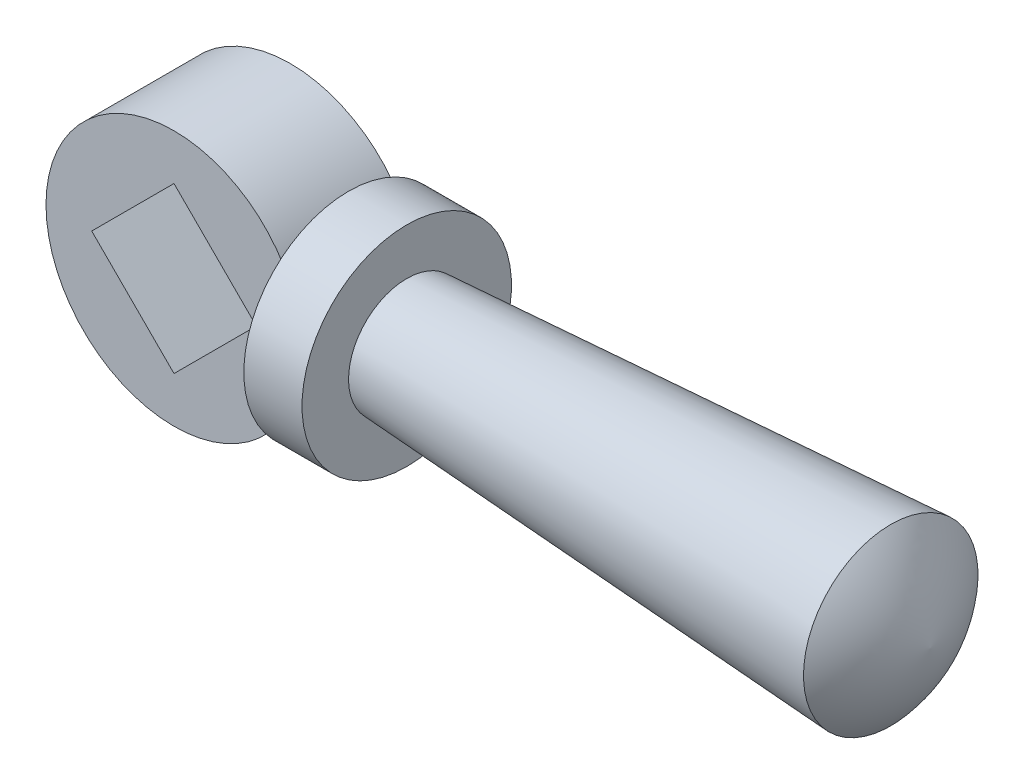
ISO-10303-21;
HEADER;
FILE_DESCRIPTION(('STEP AP214'),'2;1');
FILE_NAME('part.step','',(''),(''),'','','');
FILE_SCHEMA(('AUTOMOTIVE_DESIGN { 1 0 10303 214 1 1 1 1 }'));
ENDSEC;
DATA;
#1=APPLICATION_CONTEXT('core data for automotive mechanical design processes');
#2=APPLICATION_PROTOCOL_DEFINITION('international standard','automotive_design',2000,#1);
#3=PRODUCT_CONTEXT('',#1,'mechanical');
#4=PRODUCT('Part','Part','',(#3));
#5=PRODUCT_RELATED_PRODUCT_CATEGORY('part','',(#4));
#6=PRODUCT_DEFINITION_FORMATION('','',#4);
#7=PRODUCT_DEFINITION_CONTEXT('part definition',#1,'design');
#8=PRODUCT_DEFINITION('design','',#6,#7);
#9=PRODUCT_DEFINITION_SHAPE('','',#8);
#10=(LENGTH_UNIT() NAMED_UNIT(*) SI_UNIT(.MILLI.,.METRE.));
#11=(NAMED_UNIT(*) PLANE_ANGLE_UNIT() SI_UNIT($,.RADIAN.));
#12=(NAMED_UNIT(*) SI_UNIT($,.STERADIAN.) SOLID_ANGLE_UNIT());
#13=UNCERTAINTY_MEASURE_WITH_UNIT(LENGTH_MEASURE(1.E-05),#10,'distance_accuracy_value','');
#14=(GEOMETRIC_REPRESENTATION_CONTEXT(3) GLOBAL_UNCERTAINTY_ASSIGNED_CONTEXT((#13)) GLOBAL_UNIT_ASSIGNED_CONTEXT((#10,
#11,#12)) REPRESENTATION_CONTEXT('',''));
#15=CARTESIAN_POINT('',(0.,0.,0.));
#16=DIRECTION('',(0.,0.,1.));
#17=DIRECTION('',(1.,0.,0.));
#18=AXIS2_PLACEMENT_3D('',#15,#16,#17);
#19=CARTESIAN_POINT('',(0.,-1.81755722373603,0.));
#20=DIRECTION('',(1.,0.,0.));
#21=DIRECTION('',(0.,1.,0.));
#22=AXIS2_PLACEMENT_3D('',#19,#20,#21);
#23=PLANE('',#22);
#24=CARTESIAN_POINT('',(0.,-1.81755722373603,0.));
#25=DIRECTION('',(1.,0.,0.));
#26=DIRECTION('',(0.,1.,0.));
#27=AXIS2_PLACEMENT_3D('',#24,#25,#26);
#28=CIRCLE('',#27,9.);
#29=CARTESIAN_POINT('',(0.,7.18244277626397,0.));
#30=VERTEX_POINT('',#29);
#31=EDGE_CURVE('E135',#30,#30,#28,.T.);
#32=ORIENTED_EDGE('',*,*,#31,.F.);
#33=EDGE_LOOP('',(#32));
#34=FACE_BOUND('',#33,.T.);
#35=DIRECTION('',(0.,-1.,0.));
#36=VECTOR('',#35,1.);
#37=CARTESIAN_POINT('',(0.,-1.81755722373603,-5.));
#38=LINE('',#37,#36);
#39=CARTESIAN_POINT('',(0.,2.7650184712198,-5.));
#40=VERTEX_POINT('',#39);
#41=CARTESIAN_POINT('',(0.,-6.40013291869187,-5.));
#42=VERTEX_POINT('',#41);
#43=EDGE_CURVE('E11',#40,#42,#38,.T.);
#44=ORIENTED_EDGE('',*,*,#43,.F.);
#45=DIRECTION('',(0.,0.,1.));
#46=VECTOR('',#45,1.);
#47=CARTESIAN_POINT('',(0.,2.7650184712198,-5.));
#48=LINE('',#47,#46);
#49=CARTESIAN_POINT('',(0.,2.7650184712198,5.));
#50=VERTEX_POINT('',#49);
#51=EDGE_CURVE('E44',#40,#50,#48,.T.);
#52=ORIENTED_EDGE('',*,*,#51,.T.);
#53=DIRECTION('',(0.,-1.,0.));
#54=VECTOR('',#53,1.);
#55=CARTESIAN_POINT('',(0.,-1.81755722373603,5.));
#56=LINE('',#55,#54);
#57=CARTESIAN_POINT('',(0.,-6.40013291869187,5.));
#58=VERTEX_POINT('',#57);
#59=EDGE_CURVE('E147',#50,#58,#56,.T.);
#60=ORIENTED_EDGE('',*,*,#59,.T.);
#61=DIRECTION('',(0.,0.,1.));
#62=VECTOR('',#61,1.);
#63=CARTESIAN_POINT('',(0.,-6.40013291869187,-5.));
#64=LINE('',#63,#62);
#65=EDGE_CURVE('E150',#58,#42,#64,.F.);
#66=ORIENTED_EDGE('',*,*,#65,.T.);
#67=EDGE_LOOP('',(#44,#52,#60,#66));
#68=FACE_BOUND('',#67,.T.);
#69=ADVANCED_FACE('F37',(#34,#68),#23,.F.);
#70=CARTESIAN_POINT('',(35.1645667980468,-4.03339153847741,0.));
#71=DIRECTION('',(0.,0.,-1.));
#72=DIRECTION('',(0.,1.,0.));
#73=AXIS2_PLACEMENT_3D('',#70,#71,#72);
#74=CIRCLE('',#73,15.);
#75=TRIMMED_CURVE('',#74,(PARAMETER_VALUE(-1.42253143088032)),
(PARAMETER_VALUE(1.42253143088032)),.T.,.PARAMETER.);
#76=CARTESIAN_POINT('',(35.1645667980468,-1.81755722373603,0.));
#77=DIRECTION('',(1.,0.,0.));
#78=AXIS1_PLACEMENT('',#76,#77);
#79=SURFACE_OF_REVOLUTION('',#75,#78);
#80=CARTESIAN_POINT('',(50.,-1.81755722373603,0.));
#81=VERTEX_POINT('',#80);
#82=VERTEX_LOOP('',#81);
#83=FACE_BOUND('',#82,.T.);
#84=CARTESIAN_POINT('',(46.592714660605,-1.81755722373603,0.));
#85=DIRECTION('',(1.,0.,0.));
#86=DIRECTION('',(0.,1.,0.));
#87=AXIS2_PLACEMENT_3D('',#84,#85,#86);
#88=CIRCLE('',#87,7.5);
#89=CARTESIAN_POINT('',(46.592714660605,5.68244277626398,0.));
#90=VERTEX_POINT('',#89);
#91=EDGE_CURVE('E144',#90,#90,#88,.T.);
#92=ORIENTED_EDGE('',*,*,#91,.T.);
#93=EDGE_LOOP('',(#92));
#94=FACE_BOUND('',#93,.T.);
#95=ADVANCED_FACE('F172',(#83,#94),#79,.T.);
#96=CARTESIAN_POINT('',(5.,-1.81755722373603,0.));
#97=DIRECTION('',(1.,0.,0.));
#98=DIRECTION('',(0.,1.,0.));
#99=AXIS2_PLACEMENT_3D('',#96,#97,#98);
#100=CONICAL_SURFACE('',#99,5.,0.0600344520015872);
#101=ORIENTED_EDGE('',*,*,#91,.F.);
#102=EDGE_LOOP('',(#101));
#103=FACE_BOUND('',#102,.T.);
#104=CARTESIAN_POINT('',(5.,-1.81755722373603,0.));
#105=DIRECTION('',(1.,0.,0.));
#106=DIRECTION('',(0.,1.,0.));
#107=AXIS2_PLACEMENT_3D('',#104,#105,#106);
#108=CIRCLE('',#107,5.);
#109=CARTESIAN_POINT('',(5.,3.18244277626397,0.));
#110=VERTEX_POINT('',#109);
#111=EDGE_CURVE('E141',#110,#110,#108,.T.);
#112=ORIENTED_EDGE('',*,*,#111,.T.);
#113=EDGE_LOOP('',(#112));
#114=FACE_BOUND('',#113,.T.);
#115=ADVANCED_FACE('F177',(#103,#114),#100,.T.);
#116=CARTESIAN_POINT('',(5.,-6.81755722373603,0.));
#117=DIRECTION('',(-1.,0.,0.));
#118=DIRECTION('',(0.,-1.,0.));
#119=AXIS2_PLACEMENT_3D('',#116,#117,#118);
#120=PLANE('',#119);
#121=ORIENTED_EDGE('',*,*,#111,.F.);
#122=EDGE_LOOP('',(#121));
#123=FACE_BOUND('',#122,.T.);
#124=CARTESIAN_POINT('',(5.,-1.81755722373603,0.));
#125=DIRECTION('',(1.,0.,0.));
#126=DIRECTION('',(0.,1.,0.));
#127=AXIS2_PLACEMENT_3D('',#124,#125,#126);
#128=CIRCLE('',#127,9.);
#129=CARTESIAN_POINT('',(5.,7.18244277626397,0.));
#130=VERTEX_POINT('',#129);
#131=EDGE_CURVE('E138',#130,#130,#128,.T.);
#132=ORIENTED_EDGE('',*,*,#131,.T.);
#133=EDGE_LOOP('',(#132));
#134=FACE_BOUND('',#133,.T.);
#135=ADVANCED_FACE('F181',(#123,#134),#120,.F.);
#136=CARTESIAN_POINT('',(0.,-1.81755722373603,0.));
#137=DIRECTION('',(1.,0.,0.));
#138=DIRECTION('',(0.,1.,0.));
#139=AXIS2_PLACEMENT_3D('',#136,#137,#138);
#140=CYLINDRICAL_SURFACE('',#139,9.);
#141=ORIENTED_EDGE('',*,*,#131,.F.);
#142=EDGE_LOOP('',(#141));
#143=FACE_BOUND('',#142,.T.);
#144=ORIENTED_EDGE('',*,*,#31,.T.);
#145=EDGE_LOOP('',(#144));
#146=FACE_BOUND('',#145,.T.);
#147=ADVANCED_FACE('F168',(#143,#146),#140,.T.);
#148=CARTESIAN_POINT('',(-10.,-1.81755722373603,-5.));
#149=DIRECTION('',(0.,0.,1.));
#150=DIRECTION('',(1.,0.,0.));
#151=AXIS2_PLACEMENT_3D('',#148,#149,#150);
#152=CYLINDRICAL_SURFACE('',#151,11.);
#153=ORIENTED_EDGE('',*,*,#51,.F.);
#154=CARTESIAN_POINT('',(-10.,-1.81755722373603,-5.));
#155=DIRECTION('',(0.,0.,1.));
#156=DIRECTION('',(1.,0.,0.));
#157=AXIS2_PLACEMENT_3D('',#154,#155,#156);
#158=CIRCLE('',#157,11.);
#159=EDGE_CURVE('E129',#40,#42,#158,.T.);
#160=ORIENTED_EDGE('',*,*,#159,.T.);
#161=ORIENTED_EDGE('',*,*,#65,.F.);
#162=CARTESIAN_POINT('',(-10.,-1.81755722373603,5.));
#163=DIRECTION('',(0.,0.,1.));
#164=DIRECTION('',(1.,0.,0.));
#165=AXIS2_PLACEMENT_3D('',#162,#163,#164);
#166=CIRCLE('',#165,11.);
#167=EDGE_CURVE('E50',#50,#58,#166,.T.);
#168=ORIENTED_EDGE('',*,*,#167,.F.);
#169=EDGE_LOOP('',(#153,#160,#161,#168));
#170=FACE_BOUND('',#169,.T.);
#171=ADVANCED_FACE('F157',(#170),#152,.T.);
#172=CARTESIAN_POINT('',(-10.,-1.81755722373603,-5.));
#173=DIRECTION('',(0.,0.,1.));
#174=DIRECTION('',(1.,0.,0.));
#175=AXIS2_PLACEMENT_3D('',#172,#173,#174);
#176=PLANE('',#175);
#177=DIRECTION('',(-0.707106781186556,0.707106781186539,0.));
#178=VECTOR('',#177,1.);
#179=CARTESIAN_POINT('',(-10.,5.25351058812936,-5.));
#180=LINE('',#179,#178);
#181=CARTESIAN_POINT('',(-2.92893218813444,-1.81755722373603,-5.));
#182=VERTEX_POINT('',#181);
#183=CARTESIAN_POINT('',(-10.,5.25351058812936,-5.));
#184=VERTEX_POINT('',#183);
#185=EDGE_CURVE('E101',#182,#184,#180,.T.);
#186=ORIENTED_EDGE('',*,*,#185,.T.);
#187=DIRECTION('',(-0.707106781186539,-0.707106781186556,0.));
#188=VECTOR('',#187,1.);
#189=CARTESIAN_POINT('',(-10.,5.25351058812936,-5.));
#190=LINE('',#189,#188);
#191=CARTESIAN_POINT('',(-17.0710678118654,-1.81755722373621,-5.));
#192=VERTEX_POINT('',#191);
#193=EDGE_CURVE('E120',#184,#192,#190,.T.);
#194=ORIENTED_EDGE('',*,*,#193,.T.);
#195=DIRECTION('',(0.707106781186556,-0.707106781186539,0.));
#196=VECTOR('',#195,1.);
#197=CARTESIAN_POINT('',(-17.0710678118654,-1.81755722373621,-5.));
#198=LINE('',#197,#196);
#199=CARTESIAN_POINT('',(-9.99999999999983,-8.8886250356016,-5.));
#200=VERTEX_POINT('',#199);
#201=EDGE_CURVE('E96',#192,#200,#198,.T.);
#202=ORIENTED_EDGE('',*,*,#201,.T.);
#203=DIRECTION('',(0.707106781186539,0.707106781186556,0.));
#204=VECTOR('',#203,1.);
#205=CARTESIAN_POINT('',(-2.92893218813444,-1.81755722373603,-5.));
#206=LINE('',#205,#204);
#207=EDGE_CURVE('E123',#200,#182,#206,.T.);
#208=ORIENTED_EDGE('',*,*,#207,.T.);
#209=EDGE_LOOP('',(#186,#194,#202,#208));
#210=FACE_BOUND('',#209,.T.);
#211=ORIENTED_EDGE('',*,*,#159,.F.);
#212=ORIENTED_EDGE('',*,*,#43,.T.);
#213=EDGE_LOOP('',(#211,#212));
#214=FACE_BOUND('',#213,.T.);
#215=ADVANCED_FACE('F159',(#210,#214),#176,.F.);
#216=CARTESIAN_POINT('',(-10.,-1.81755722373603,5.));
#217=DIRECTION('',(0.,0.,1.));
#218=DIRECTION('',(1.,0.,0.));
#219=AXIS2_PLACEMENT_3D('',#216,#217,#218);
#220=PLANE('',#219);
#221=DIRECTION('',(0.707106781186556,-0.707106781186539,0.));
#222=VECTOR('',#221,1.);
#223=CARTESIAN_POINT('',(-17.0710678118654,-1.81755722373621,5.));
#224=LINE('',#223,#222);
#225=CARTESIAN_POINT('',(-17.0710678118654,-1.81755722373621,5.));
#226=VERTEX_POINT('',#225);
#227=CARTESIAN_POINT('',(-9.99999999999983,-8.8886250356016,5.));
#228=VERTEX_POINT('',#227);
#229=EDGE_CURVE('E93',#226,#228,#224,.T.);
#230=ORIENTED_EDGE('',*,*,#229,.F.);
#231=DIRECTION('',(-0.707106781186539,-0.707106781186556,0.));
#232=VECTOR('',#231,1.);
#233=CARTESIAN_POINT('',(-10.,5.25351058812936,5.));
#234=LINE('',#233,#232);
#235=CARTESIAN_POINT('',(-10.,5.25351058812936,5.));
#236=VERTEX_POINT('',#235);
#237=EDGE_CURVE('E104',#236,#226,#234,.T.);
#238=ORIENTED_EDGE('',*,*,#237,.F.);
#239=DIRECTION('',(-0.707106781186556,0.707106781186539,0.));
#240=VECTOR('',#239,1.);
#241=CARTESIAN_POINT('',(-10.,5.25351058812936,5.));
#242=LINE('',#241,#240);
#243=CARTESIAN_POINT('',(-2.92893218813444,-1.81755722373603,5.));
#244=VERTEX_POINT('',#243);
#245=EDGE_CURVE('E115',#244,#236,#242,.T.);
#246=ORIENTED_EDGE('',*,*,#245,.F.);
#247=DIRECTION('',(0.707106781186539,0.707106781186556,0.));
#248=VECTOR('',#247,1.);
#249=CARTESIAN_POINT('',(-2.92893218813444,-1.81755722373603,5.));
#250=LINE('',#249,#248);
#251=EDGE_CURVE('E113',#228,#244,#250,.T.);
#252=ORIENTED_EDGE('',*,*,#251,.F.);
#253=EDGE_LOOP('',(#230,#238,#246,#252));
#254=FACE_BOUND('',#253,.T.);
#255=ORIENTED_EDGE('',*,*,#59,.F.);
#256=ORIENTED_EDGE('',*,*,#167,.T.);
#257=EDGE_LOOP('',(#255,#256));
#258=FACE_BOUND('',#257,.T.);
#259=ADVANCED_FACE('F111',(#254,#258),#220,.T.);
#260=CARTESIAN_POINT('',(-10.,5.25351058812936,-5.));
#261=DIRECTION('',(-0.707106781186556,0.707106781186539,0.));
#262=DIRECTION('',(-0.707106781186539,-0.707106781186556,0.));
#263=AXIS2_PLACEMENT_3D('',#260,#261,#262);
#264=PLANE('',#263);
#265=DIRECTION('',(0.,0.,1.));
#266=VECTOR('',#265,1.);
#267=CARTESIAN_POINT('',(-10.,5.25351058812936,-5.));
#268=LINE('',#267,#266);
#269=EDGE_CURVE('E106',#184,#236,#268,.T.);
#270=ORIENTED_EDGE('',*,*,#269,.T.);
#271=ORIENTED_EDGE('',*,*,#237,.T.);
#272=DIRECTION('',(0.,0.,1.));
#273=VECTOR('',#272,1.);
#274=CARTESIAN_POINT('',(-17.0710678118654,-1.81755722373621,-5.));
#275=LINE('',#274,#273);
#276=EDGE_CURVE('E88',#192,#226,#275,.T.);
#277=ORIENTED_EDGE('',*,*,#276,.F.);
#278=ORIENTED_EDGE('',*,*,#193,.F.);
#279=EDGE_LOOP('',(#270,#271,#277,#278));
#280=FACE_BOUND('',#279,.T.);
#281=ADVANCED_FACE('F105',(#280),#264,.F.);
#282=CARTESIAN_POINT('',(-10.,5.25351058812936,-5.));
#283=DIRECTION('',(0.707106781186539,0.707106781186556,0.));
#284=DIRECTION('',(-0.707106781186556,0.707106781186539,0.));
#285=AXIS2_PLACEMENT_3D('',#282,#283,#284);
#286=PLANE('',#285);
#287=DIRECTION('',(0.,0.,1.));
#288=VECTOR('',#287,1.);
#289=CARTESIAN_POINT('',(-2.92893218813444,-1.81755722373603,-5.));
#290=LINE('',#289,#288);
#291=EDGE_CURVE('E130',#182,#244,#290,.T.);
#292=ORIENTED_EDGE('',*,*,#291,.T.);
#293=ORIENTED_EDGE('',*,*,#245,.T.);
#294=ORIENTED_EDGE('',*,*,#269,.F.);
#295=ORIENTED_EDGE('',*,*,#185,.F.);
#296=EDGE_LOOP('',(#292,#293,#294,#295));
#297=FACE_BOUND('',#296,.T.);
#298=ADVANCED_FACE('F239',(#297),#286,.F.);
#299=CARTESIAN_POINT('',(-2.92893218813444,-1.81755722373603,-5.));
#300=DIRECTION('',(0.707106781186556,-0.707106781186539,0.));
#301=DIRECTION('',(0.707106781186539,0.707106781186556,0.));
#302=AXIS2_PLACEMENT_3D('',#299,#300,#301);
#303=PLANE('',#302);
#304=DIRECTION('',(0.,0.,1.));
#305=VECTOR('',#304,1.);
#306=CARTESIAN_POINT('',(-9.99999999999983,-8.8886250356016,-5.));
#307=LINE('',#306,#305);
#308=EDGE_CURVE('E100',#200,#228,#307,.T.);
#309=ORIENTED_EDGE('',*,*,#308,.T.);
#310=ORIENTED_EDGE('',*,*,#251,.T.);
#311=ORIENTED_EDGE('',*,*,#291,.F.);
#312=ORIENTED_EDGE('',*,*,#207,.F.);
#313=EDGE_LOOP('',(#309,#310,#311,#312));
#314=FACE_BOUND('',#313,.T.);
#315=ADVANCED_FACE('F247',(#314),#303,.F.);
#316=CARTESIAN_POINT('',(-17.0710678118654,-1.81755722373621,-5.));
#317=DIRECTION('',(-0.707106781186539,-0.707106781186556,0.));
#318=DIRECTION('',(0.707106781186556,-0.707106781186539,0.));
#319=AXIS2_PLACEMENT_3D('',#316,#317,#318);
#320=PLANE('',#319);
#321=ORIENTED_EDGE('',*,*,#276,.T.);
#322=ORIENTED_EDGE('',*,*,#229,.T.);
#323=ORIENTED_EDGE('',*,*,#308,.F.);
#324=ORIENTED_EDGE('',*,*,#201,.F.);
#325=EDGE_LOOP('',(#321,#322,#323,#324));
#326=FACE_BOUND('',#325,.T.);
#327=ADVANCED_FACE('F90',(#326),#320,.F.);
#328=CLOSED_SHELL('',(#69,#95,#115,#135,#147,#171,#215,#259,#281,#298,#315,#327));
#329=MANIFOLD_SOLID_BREP('B2',#328);
#330=ADVANCED_BREP_SHAPE_REPRESENTATION('',(#18,#329),#14);
#331=SHAPE_DEFINITION_REPRESENTATION(#9,#330);
ENDSEC;
END-ISO-10303-21;
